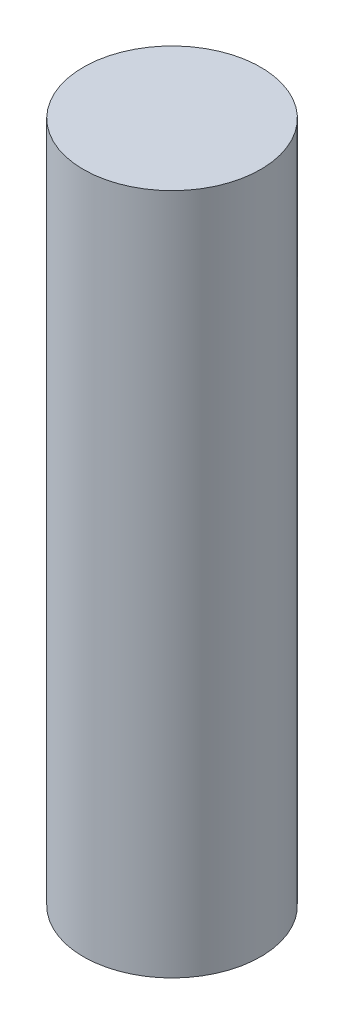
ISO-10303-21;
HEADER;
FILE_DESCRIPTION(('STEP AP214'),'2;1');
FILE_NAME('part.step','',(''),(''),'','','');
FILE_SCHEMA(('AUTOMOTIVE_DESIGN { 1 0 10303 214 1 1 1 1 }'));
ENDSEC;
DATA;
#1=APPLICATION_CONTEXT('core data for automotive mechanical design processes');
#2=APPLICATION_PROTOCOL_DEFINITION('international standard','automotive_design',2000,#1);
#3=PRODUCT_CONTEXT('',#1,'mechanical');
#4=PRODUCT('Part','Part','',(#3));
#5=PRODUCT_RELATED_PRODUCT_CATEGORY('part','',(#4));
#6=PRODUCT_DEFINITION_FORMATION('','',#4);
#7=PRODUCT_DEFINITION_CONTEXT('part definition',#1,'design');
#8=PRODUCT_DEFINITION('design','',#6,#7);
#9=PRODUCT_DEFINITION_SHAPE('','',#8);
#10=(LENGTH_UNIT() NAMED_UNIT(*) SI_UNIT(.MILLI.,.METRE.));
#11=(NAMED_UNIT(*) PLANE_ANGLE_UNIT() SI_UNIT($,.RADIAN.));
#12=(NAMED_UNIT(*) SI_UNIT($,.STERADIAN.) SOLID_ANGLE_UNIT());
#13=UNCERTAINTY_MEASURE_WITH_UNIT(LENGTH_MEASURE(1.E-05),#10,'distance_accuracy_value','');
#14=(GEOMETRIC_REPRESENTATION_CONTEXT(3) GLOBAL_UNCERTAINTY_ASSIGNED_CONTEXT((#13)) GLOBAL_UNIT_ASSIGNED_CONTEXT((#10,
#11,#12)) REPRESENTATION_CONTEXT('',''));
#15=CARTESIAN_POINT('',(0.,0.,0.));
#16=DIRECTION('',(0.,0.,1.));
#17=DIRECTION('',(1.,0.,0.));
#18=AXIS2_PLACEMENT_3D('',#15,#16,#17);
#19=CARTESIAN_POINT('',(0.,100.,0.));
#20=DIRECTION('',(0.,-1.,0.));
#21=DIRECTION('',(0.,0.,-1.));
#22=AXIS2_PLACEMENT_3D('',#19,#20,#21);
#23=CYLINDRICAL_SURFACE('',#22,13.);
#24=CARTESIAN_POINT('',(0.,100.,0.));
#25=DIRECTION('',(0.,1.,0.));
#26=DIRECTION('',(0.,0.,1.));
#27=AXIS2_PLACEMENT_3D('',#24,#25,#26);
#28=CIRCLE('',#27,13.);
#29=CARTESIAN_POINT('',(0.,100.,13.));
#30=VERTEX_POINT('',#29);
#31=EDGE_CURVE('E10',#30,#30,#28,.T.);
#32=ORIENTED_EDGE('',*,*,#31,.F.);
#33=EDGE_LOOP('',(#32));
#34=FACE_BOUND('',#33,.T.);
#35=CARTESIAN_POINT('',(0.,0.,0.));
#36=DIRECTION('',(0.,1.,0.));
#37=DIRECTION('',(0.,0.,1.));
#38=AXIS2_PLACEMENT_3D('',#35,#36,#37);
#39=CIRCLE('',#38,13.);
#40=CARTESIAN_POINT('',(0.,0.,13.));
#41=VERTEX_POINT('',#40);
#42=EDGE_CURVE('E46',#41,#41,#39,.T.);
#43=ORIENTED_EDGE('',*,*,#42,.T.);
#44=EDGE_LOOP('',(#43));
#45=FACE_BOUND('',#44,.T.);
#46=ADVANCED_FACE('F43',(#34,#45),#23,.T.);
#47=CARTESIAN_POINT('',(0.,100.,0.));
#48=DIRECTION('',(0.,1.,0.));
#49=DIRECTION('',(0.,0.,1.));
#50=AXIS2_PLACEMENT_3D('',#47,#48,#49);
#51=PLANE('',#50);
#52=ORIENTED_EDGE('',*,*,#31,.T.);
#53=EDGE_LOOP('',(#52));
#54=FACE_BOUND('',#53,.T.);
#55=ADVANCED_FACE('F76',(#54),#51,.T.);
#56=CARTESIAN_POINT('',(0.,0.,0.));
#57=DIRECTION('',(0.,1.,0.));
#58=DIRECTION('',(0.,0.,1.));
#59=AXIS2_PLACEMENT_3D('',#56,#57,#58);
#60=PLANE('',#59);
#61=CARTESIAN_POINT('',(0.,0.,0.));
#62=DIRECTION('',(0.,-1.,0.));
#63=DIRECTION('',(0.,0.,-1.));
#64=AXIS2_PLACEMENT_3D('',#61,#62,#63);
#65=CIRCLE('',#64,10.);
#66=CARTESIAN_POINT('',(0.,0.,-10.));
#67=VERTEX_POINT('',#66);
#68=EDGE_CURVE('E57',#67,#67,#65,.T.);
#69=ORIENTED_EDGE('',*,*,#68,.F.);
#70=EDGE_LOOP('',(#69));
#71=FACE_BOUND('',#70,.T.);
#72=ORIENTED_EDGE('',*,*,#42,.F.);
#73=EDGE_LOOP('',(#72));
#74=FACE_BOUND('',#73,.T.);
#75=ADVANCED_FACE('F70',(#71,#74),#60,.F.);
#76=CARTESIAN_POINT('',(0.,20.,0.));
#77=DIRECTION('',(0.,-1.,0.));
#78=DIRECTION('',(0.,0.,-1.));
#79=AXIS2_PLACEMENT_3D('',#76,#77,#78);
#80=CYLINDRICAL_SURFACE('',#79,10.);
#81=CARTESIAN_POINT('',(0.,20.,0.));
#82=DIRECTION('',(0.,-1.,0.));
#83=DIRECTION('',(0.,0.,-1.));
#84=AXIS2_PLACEMENT_3D('',#81,#82,#83);
#85=CIRCLE('',#84,10.);
#86=CARTESIAN_POINT('',(0.,20.,-10.));
#87=VERTEX_POINT('',#86);
#88=EDGE_CURVE('E55',#87,#87,#85,.T.);
#89=ORIENTED_EDGE('',*,*,#88,.F.);
#90=EDGE_LOOP('',(#89));
#91=FACE_BOUND('',#90,.T.);
#92=ORIENTED_EDGE('',*,*,#68,.T.);
#93=EDGE_LOOP('',(#92));
#94=FACE_BOUND('',#93,.T.);
#95=ADVANCED_FACE('F67',(#91,#94),#80,.F.);
#96=CARTESIAN_POINT('',(0.,20.,0.));
#97=DIRECTION('',(0.,-1.,0.));
#98=DIRECTION('',(0.,0.,-1.));
#99=AXIS2_PLACEMENT_3D('',#96,#97,#98);
#100=PLANE('',#99);
#101=ORIENTED_EDGE('',*,*,#88,.T.);
#102=EDGE_LOOP('',(#101));
#103=FACE_BOUND('',#102,.T.);
#104=ADVANCED_FACE('F65',(#103),#100,.T.);
#105=CLOSED_SHELL('',(#46,#55,#75,#95,#104));
#106=MANIFOLD_SOLID_BREP('B2',#105);
#107=ADVANCED_BREP_SHAPE_REPRESENTATION('',(#18,#106),#14);
#108=SHAPE_DEFINITION_REPRESENTATION(#9,#107);
ENDSEC;
END-ISO-10303-21;
